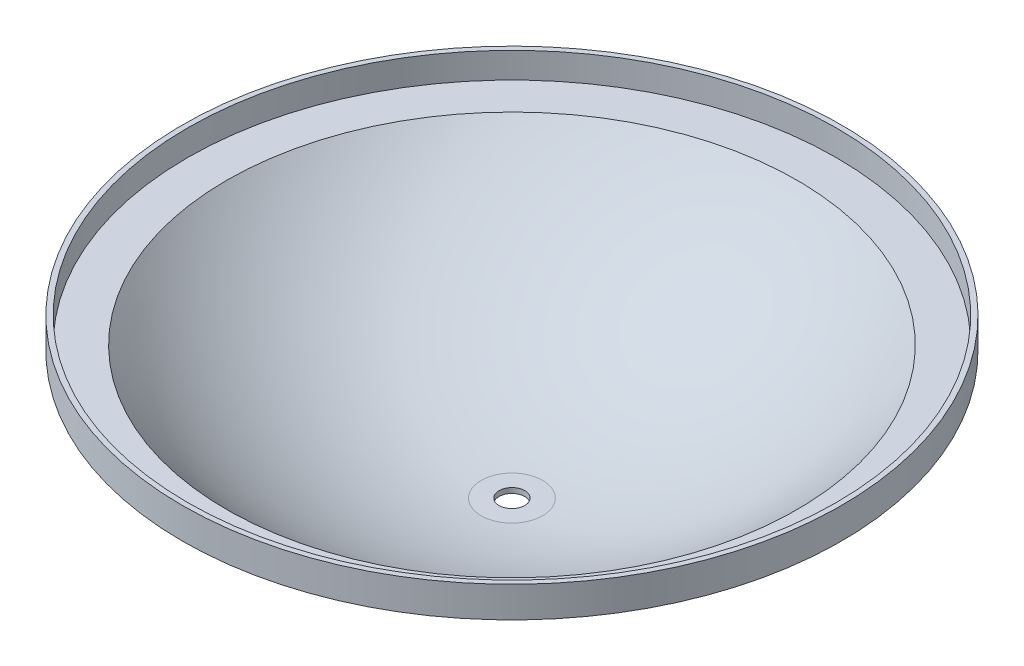
ISO-10303-21;
HEADER;
FILE_DESCRIPTION(('STEP AP214'),'2;1');
FILE_NAME('part.step','',(''),(''),'','','');
FILE_SCHEMA(('AUTOMOTIVE_DESIGN { 1 0 10303 214 1 1 1 1 }'));
ENDSEC;
DATA;
#1=APPLICATION_CONTEXT('core data for automotive mechanical design processes');
#2=APPLICATION_PROTOCOL_DEFINITION('international standard','automotive_design',2000,#1);
#3=PRODUCT_CONTEXT('',#1,'mechanical');
#4=PRODUCT('Part','Part','',(#3));
#5=PRODUCT_RELATED_PRODUCT_CATEGORY('part','',(#4));
#6=PRODUCT_DEFINITION_FORMATION('','',#4);
#7=PRODUCT_DEFINITION_CONTEXT('part definition',#1,'design');
#8=PRODUCT_DEFINITION('design','',#6,#7);
#9=PRODUCT_DEFINITION_SHAPE('','',#8);
#10=(LENGTH_UNIT() NAMED_UNIT(*) SI_UNIT(.MILLI.,.METRE.));
#11=(NAMED_UNIT(*) PLANE_ANGLE_UNIT() SI_UNIT($,.RADIAN.));
#12=(NAMED_UNIT(*) SI_UNIT($,.STERADIAN.) SOLID_ANGLE_UNIT());
#13=UNCERTAINTY_MEASURE_WITH_UNIT(LENGTH_MEASURE(1.E-05),#10,'distance_accuracy_value','');
#14=(GEOMETRIC_REPRESENTATION_CONTEXT(3) GLOBAL_UNCERTAINTY_ASSIGNED_CONTEXT((#13)) GLOBAL_UNIT_ASSIGNED_CONTEXT((#10,
#11,#12)) REPRESENTATION_CONTEXT('',''));
#15=CARTESIAN_POINT('',(0.,0.,0.));
#16=DIRECTION('',(0.,0.,1.));
#17=DIRECTION('',(1.,0.,0.));
#18=AXIS2_PLACEMENT_3D('',#15,#16,#17);
#19=CARTESIAN_POINT('',(-64.,-41.,0.));
#20=DIRECTION('',(0.,1.,0.));
#21=DIRECTION('',(0.,0.,1.));
#22=AXIS2_PLACEMENT_3D('',#19,#20,#21);
#23=PLANE('',#22);
#24=CARTESIAN_POINT('',(0.,-41.,0.));
#25=DIRECTION('',(0.,1.,0.));
#26=DIRECTION('',(0.,0.,1.));
#27=AXIS2_PLACEMENT_3D('',#24,#25,#26);
#28=CIRCLE('',#27,64.);
#29=CARTESIAN_POINT('',(0.,-41.,64.));
#30=VERTEX_POINT('',#29);
#31=EDGE_CURVE('E10',#30,#30,#28,.T.);
#32=ORIENTED_EDGE('',*,*,#31,.T.);
#33=EDGE_LOOP('',(#32));
#34=FACE_BOUND('',#33,.T.);
#35=CARTESIAN_POINT('',(0.,-41.,0.));
#36=DIRECTION('',(0.,1.,0.));
#37=DIRECTION('',(0.,0.,1.));
#38=AXIS2_PLACEMENT_3D('',#35,#36,#37);
#39=CIRCLE('',#38,63.);
#40=CARTESIAN_POINT('',(0.,-41.,63.));
#41=VERTEX_POINT('',#40);
#42=EDGE_CURVE('E69',#41,#41,#39,.T.);
#43=ORIENTED_EDGE('',*,*,#42,.F.);
#44=EDGE_LOOP('',(#43));
#45=FACE_BOUND('',#44,.T.);
#46=ADVANCED_FACE('F35',(#34,#45),#23,.T.);
#47=CARTESIAN_POINT('',(0.,36.2989122017747,0.));
#48=DIRECTION('',(0.,1.,0.));
#49=DIRECTION('',(0.,0.,1.));
#50=AXIS2_PLACEMENT_3D('',#47,#48,#49);
#51=CYLINDRICAL_SURFACE('',#50,64.);
#52=CARTESIAN_POINT('',(0.,-47.,0.));
#53=DIRECTION('',(0.,1.,0.));
#54=DIRECTION('',(0.,0.,1.));
#55=AXIS2_PLACEMENT_3D('',#52,#53,#54);
#56=CIRCLE('',#55,64.);
#57=CARTESIAN_POINT('',(0.,-47.,64.));
#58=VERTEX_POINT('',#57);
#59=EDGE_CURVE('E41',#58,#58,#56,.T.);
#60=ORIENTED_EDGE('',*,*,#59,.T.);
#61=EDGE_LOOP('',(#60));
#62=FACE_BOUND('',#61,.T.);
#63=ORIENTED_EDGE('',*,*,#31,.F.);
#64=EDGE_LOOP('',(#63));
#65=FACE_BOUND('',#64,.T.);
#66=ADVANCED_FACE('F77',(#62,#65),#51,.T.);
#67=CARTESIAN_POINT('',(-64.,-47.,0.));
#68=DIRECTION('',(0.,-1.,0.));
#69=DIRECTION('',(0.,0.,-1.));
#70=AXIS2_PLACEMENT_3D('',#67,#68,#69);
#71=PLANE('',#70);
#72=CARTESIAN_POINT('',(0.,-47.,0.));
#73=DIRECTION('',(0.,1.,0.));
#74=DIRECTION('',(0.,0.,1.));
#75=AXIS2_PLACEMENT_3D('',#72,#73,#74);
#76=CIRCLE('',#75,55.8569601750758);
#77=CARTESIAN_POINT('',(-55.8569601750758,-47.,0.));
#78=VERTEX_POINT('',#77);
#79=EDGE_CURVE('E45',#78,#78,#76,.T.);
#80=ORIENTED_EDGE('',*,*,#79,.T.);
#81=EDGE_LOOP('',(#80));
#82=FACE_BOUND('',#81,.T.);
#83=ORIENTED_EDGE('',*,*,#59,.F.);
#84=EDGE_LOOP('',(#83));
#85=FACE_BOUND('',#84,.T.);
#86=ADVANCED_FACE('F81',(#82,#85),#71,.T.);
#87=CARTESIAN_POINT('',(0.,0.,0.));
#88=DIRECTION('',(0.,1.,0.));
#89=DIRECTION('',(-1.,0.,0.));
#90=AXIS2_PLACEMENT_3D('',#87,#88,#89);
#91=SPHERICAL_SURFACE('',#90,73.);
#92=CARTESIAN_POINT('',(0.,-72.7530068107154,0.));
#93=DIRECTION('',(0.,1.,0.));
#94=DIRECTION('',(0.,0.,1.));
#95=AXIS2_PLACEMENT_3D('',#92,#93,#94);
#96=CIRCLE('',#95,5.99999999999998);
#97=CARTESIAN_POINT('',(-5.99999999999983,-72.7530068107154,0.));
#98=VERTEX_POINT('',#97);
#99=EDGE_CURVE('E49',#98,#98,#96,.T.);
#100=CARTESIAN_POINT('',(-5.99999999999983,-72.7530068107154,0.));
#101=CARTESIAN_POINT('',(-6.59794740306016,-72.7036952189983,0.));
#102=CARTESIAN_POINT('',(-7.19528652890829,-72.647008800253,0.));
#103=CARTESIAN_POINT('',(-8.3883858505504,-72.5189278211517,0.));
#104=CARTESIAN_POINT('',(-8.98414604634437,-72.4475332607957,0.));
#105=CARTESIAN_POINT('',(-10.1737251322484,-72.2900775109191,0.));
#106=CARTESIAN_POINT('',(-10.7675440223585,-72.2040163213985,0.));
#107=CARTESIAN_POINT('',(-11.9528795586112,-72.0172801375548,0.));
#108=CARTESIAN_POINT('',(-12.5443962047539,-71.9166051432318,0.));
#109=CARTESIAN_POINT('',(-13.7247676454467,-71.7007024161682,0.));
#110=CARTESIAN_POINT('',(-14.313622439997,-71.5854746834277,0.));
#111=CARTESIAN_POINT('',(-15.4883122065308,-71.3405365647845,0.));
#112=CARTESIAN_POINT('',(-16.0741471785144,-71.2108261788817,0.));
#113=CARTESIAN_POINT('',(-17.2424411597944,-70.9370015973304,0.));
#114=CARTESIAN_POINT('',(-17.8249001690909,-70.792887401682,0.));
#115=CARTESIAN_POINT('',(-18.9860881385073,-70.4903428127276,0.));
#116=CARTESIAN_POINT('',(-19.5648170986272,-70.3319124194217,0.));
#117=CARTESIAN_POINT('',(-20.7181931504065,-70.0008317469924,0.));
#118=CARTESIAN_POINT('',(-21.2928402420659,-69.8281814678689,0.));
#119=CARTESIAN_POINT('',(-22.4377032191726,-69.4687659810423,0.));
#120=CARTESIAN_POINT('',(-23.0079191046199,-69.282000773339,0.));
#121=CARTESIAN_POINT('',(-24.1435730253315,-68.8944689670589,0.));
#122=CARTESIAN_POINT('',(-24.7090110605958,-68.6937023684821,0.));
#123=CARTESIAN_POINT('',(-25.8347655415137,-68.2782898299088,0.));
#124=CARTESIAN_POINT('',(-26.3950819871673,-68.0636438899124,0.));
#125=CARTESIAN_POINT('',(-27.5102526629362,-67.6206031554257,0.));
#126=CARTESIAN_POINT('',(-28.0651068930515,-67.3922083609354,0.));
#127=CARTESIAN_POINT('',(-29.1690158323905,-66.9218087625542,0.));
#128=CARTESIAN_POINT('',(-29.7180705416142,-66.6798039586633,0.));
#129=CARTESIAN_POINT('',(-30.8100466594445,-66.18233146033,0.));
#130=CARTESIAN_POINT('',(-31.352968068051,-65.9268637658876,0.));
#131=CARTESIAN_POINT('',(-32.4323475334594,-65.4026207896215,0.));
#132=CARTESIAN_POINT('',(-32.9688055902613,-65.1338455077979,0.));
#133=CARTESIAN_POINT('',(-34.0349322300547,-64.5831507498489,0.));
#134=CARTESIAN_POINT('',(-34.5646008130462,-64.3012312737236,0.));
#135=CARTESIAN_POINT('',(-35.6168265106502,-63.7244195108309,0.));
#136=CARTESIAN_POINT('',(-36.1393836252627,-63.4295272240635,0.));
#137=CARTESIAN_POINT('',(-37.1770687147229,-62.8269491099392,0.));
#138=CARTESIAN_POINT('',(-37.6921966895706,-62.5192632825823,0.));
#139=CARTESIAN_POINT('',(-38.7147103444164,-61.8912851347431,0.));
#140=CARTESIAN_POINT('',(-39.2220960244146,-61.5709928142608,0.));
#141=CARTESIAN_POINT('',(-40.2288166411488,-60.9179963913368,0.));
#142=CARTESIAN_POINT('',(-40.7281515778849,-60.585292288895,0.));
#143=CARTESIAN_POINT('',(-41.7184671538702,-59.9076745585546,0.));
#144=CARTESIAN_POINT('',(-42.2094477931194,-59.5627609306561,0.));
#145=CARTESIAN_POINT('',(-43.182756298613,-58.8609338282726,0.));
#146=CARTESIAN_POINT('',(-43.6650841648575,-58.5040203537876,0.));
#147=CARTESIAN_POINT('',(-44.6207939090404,-57.7784105320553,0.));
#148=CARTESIAN_POINT('',(-45.0941757869788,-57.409714184808,0.));
#149=CARTESIAN_POINT('',(-46.0317057774879,-56.6607627542264,0.));
#150=CARTESIAN_POINT('',(-46.4958538900587,-56.2805076708921,0.));
#151=CARTESIAN_POINT('',(-47.4146341868025,-55.5086699321554,0.));
#152=CARTESIAN_POINT('',(-47.8692663709757,-55.117087276753,0.));
#153=CARTESIAN_POINT('',(-48.7687384302965,-54.3228324419185,0.));
#154=CARTESIAN_POINT('',(-49.2135783054443,-53.9201602624864,0.));
#155=CARTESIAN_POINT('',(-50.0931953283023,-53.1039711773706,0.));
#156=CARTESIAN_POINT('',(-50.5279724760126,-52.6904542716869,0.));
#157=CARTESIAN_POINT('',(-51.3871997081645,-51.8528270938295,0.));
#158=CARTESIAN_POINT('',(-51.8116497926061,-51.4287168216557,0.));
#159=CARTESIAN_POINT('',(-52.6499649699749,-50.5701608250817,0.));
#160=CARTESIAN_POINT('',(-53.063830062902,-50.1357151006814,0.));
#161=CARTESIAN_POINT('',(-53.8807232801659,-49.2567519692716,0.));
#162=CARTESIAN_POINT('',(-54.2837514045026,-48.812234562262,0.));
#163=CARTESIAN_POINT('',(-55.0787271004088,-47.9133995543608,0.));
#164=CARTESIAN_POINT('',(-55.4706746719783,-47.4590819534691,0.));
#165=CARTESIAN_POINT('',(-55.8569601750758,-47.,0.));
#166=B_SPLINE_CURVE_WITH_KNOTS('',3,(#100,#101,#102,#103,#104,#105,#106,#107,#108,#109,#110,
#111,#112,#113,#114,#115,#116,#117,#118,#119,#120,#121,#122,#123,#124,#125,#126,#127,#128,#129,
#130,#131,#132,#133,#134,#135,#136,#137,#138,#139,#140,#141,#142,#143,#144,#145,#146,#147,#148,
#149,#150,#151,#152,#153,#154,#155,#156,#157,#158,#159,#160,#161,#162,#163,#164,#165),
.UNSPECIFIED.,.F.,.F.,(4,2,2,2,2,2,2,2,2,2,2,2,2,2,2,2,2,2,2,2,2,2,2,2,2,2,2,2,2,2,2,2,4),(0.,
1.79988611370583,3.59977222741166,5.39965834111747,7.1995444548233,8.99943056852913,
10.799316682235,12.5992027959408,14.3990889096466,16.1989750233524,17.9988611370583,
19.7987472507641,21.5986333644699,23.3985194781757,25.1984055918816,26.9982917055874,
28.7981778192932,30.598063932999,32.3979500467049,34.1978361604107,35.9977222741165,
37.7976083878224,39.5974945015282,41.397380615234,43.1972667289398,44.9971528426456,
46.7970389563515,48.5969250700573,50.3968111837631,52.1966972974689,53.9965834111748,
55.7964695248806,57.5963556385864),.UNSPECIFIED.);
#167=EDGE_CURVE('BSEAM85',#98,#78,#166,.T.);
#168=ORIENTED_EDGE('',*,*,#99,.T.);
#169=ORIENTED_EDGE('',*,*,#79,.F.);
#170=ORIENTED_EDGE('',*,*,#167,.T.);
#171=ORIENTED_EDGE('',*,*,#167,.F.);
#172=EDGE_LOOP('',(#168,#170,#169,#171));
#173=FACE_BOUND('',#172,.T.);
#174=ADVANCED_FACE('F85',(#173),#91,.T.);
#175=CARTESIAN_POINT('',(-2.49999999999998,-72.7530068107154,0.));
#176=DIRECTION('',(0.,-1.,0.));
#177=DIRECTION('',(0.,0.,-1.));
#178=AXIS2_PLACEMENT_3D('',#175,#176,#177);
#179=PLANE('',#178);
#180=CARTESIAN_POINT('',(0.,-72.7530068107154,0.));
#181=DIRECTION('',(0.,1.,0.));
#182=DIRECTION('',(0.,0.,1.));
#183=AXIS2_PLACEMENT_3D('',#180,#181,#182);
#184=CIRCLE('',#183,2.49999999999998);
#185=CARTESIAN_POINT('',(0.,-72.7530068107154,2.49999999999998));
#186=VERTEX_POINT('',#185);
#187=EDGE_CURVE('E54',#186,#186,#184,.T.);
#188=ORIENTED_EDGE('',*,*,#187,.T.);
#189=EDGE_LOOP('',(#188));
#190=FACE_BOUND('',#189,.T.);
#191=ORIENTED_EDGE('',*,*,#99,.F.);
#192=EDGE_LOOP('',(#191));
#193=FACE_BOUND('',#192,.T.);
#194=ADVANCED_FACE('F92',(#190,#193),#179,.T.);
#195=CARTESIAN_POINT('',(0.,36.2989122017747,0.));
#196=DIRECTION('',(0.,1.,0.));
#197=DIRECTION('',(0.,0.,1.));
#198=AXIS2_PLACEMENT_3D('',#195,#196,#197);
#199=CYLINDRICAL_SURFACE('',#198,2.49999999999998);
#200=CARTESIAN_POINT('',(0.,-71.7530068107154,0.));
#201=DIRECTION('',(0.,1.,0.));
#202=DIRECTION('',(0.,0.,1.));
#203=AXIS2_PLACEMENT_3D('',#200,#201,#202);
#204=CIRCLE('',#203,2.49999999999998);
#205=CARTESIAN_POINT('',(0.,-71.7530068107154,2.49999999999998));
#206=VERTEX_POINT('',#205);
#207=EDGE_CURVE('E57',#206,#206,#204,.T.);
#208=ORIENTED_EDGE('',*,*,#207,.T.);
#209=EDGE_LOOP('',(#208));
#210=FACE_BOUND('',#209,.T.);
#211=ORIENTED_EDGE('',*,*,#187,.F.);
#212=EDGE_LOOP('',(#211));
#213=FACE_BOUND('',#212,.T.);
#214=ADVANCED_FACE('F96',(#210,#213),#199,.F.);
#215=CARTESIAN_POINT('',(-2.49999999999998,-71.7530068107154,0.));
#216=DIRECTION('',(0.,1.,0.));
#217=DIRECTION('',(0.,0.,1.));
#218=AXIS2_PLACEMENT_3D('',#215,#216,#217);
#219=PLANE('',#218);
#220=CARTESIAN_POINT('',(0.,-71.7530068107154,0.));
#221=DIRECTION('',(0.,1.,0.));
#222=DIRECTION('',(0.,0.,1.));
#223=AXIS2_PLACEMENT_3D('',#220,#221,#222);
#224=CIRCLE('',#223,5.95869227443659);
#225=CARTESIAN_POINT('',(-5.95869227443651,-71.7530068107154,0.));
#226=VERTEX_POINT('',#225);
#227=EDGE_CURVE('E60',#226,#226,#224,.T.);
#228=ORIENTED_EDGE('',*,*,#227,.T.);
#229=EDGE_LOOP('',(#228));
#230=FACE_BOUND('',#229,.T.);
#231=ORIENTED_EDGE('',*,*,#207,.F.);
#232=EDGE_LOOP('',(#231));
#233=FACE_BOUND('',#232,.T.);
#234=ADVANCED_FACE('F100',(#230,#233),#219,.T.);
#235=CARTESIAN_POINT('',(0.,0.,0.));
#236=DIRECTION('',(0.,1.,0.));
#237=DIRECTION('',(-1.,0.,0.));
#238=AXIS2_PLACEMENT_3D('',#235,#236,#237);
#239=SPHERICAL_SURFACE('',#238,72.);
#240=CARTESIAN_POINT('',(0.,-46.,0.));
#241=DIRECTION('',(0.,1.,0.));
#242=DIRECTION('',(0.,0.,1.));
#243=AXIS2_PLACEMENT_3D('',#240,#241,#242);
#244=CIRCLE('',#243,55.3895296965049);
#245=CARTESIAN_POINT('',(-55.3895296965049,-46.,0.));
#246=VERTEX_POINT('',#245);
#247=EDGE_CURVE('E63',#246,#246,#244,.T.);
#248=CARTESIAN_POINT('',(-55.3895296965049,-46.,0.));
#249=CARTESIAN_POINT('',(-55.008646684964,-46.4586314994839,0.));
#250=CARTESIAN_POINT('',(-54.6220649866801,-46.9125302512128,0.));
#251=CARTESIAN_POINT('',(-53.8377481679489,-47.8105869402255,0.));
#252=CARTESIAN_POINT('',(-53.4400130475016,-48.2547448775094,0.));
#253=CARTESIAN_POINT('',(-52.633633335766,-49.1330446186974,0.));
#254=CARTESIAN_POINT('',(-52.2249887444777,-49.5671864226016,0.));
#255=CARTESIAN_POINT('',(-51.3970426175679,-50.425186368543,0.));
#256=CARTESIAN_POINT('',(-50.9777410819464,-50.8490445105801,0.));
#257=CARTESIAN_POINT('',(-50.1287396742068,-51.6862155178882,0.));
#258=CARTESIAN_POINT('',(-49.6990398020887,-52.0995283831592,0.));
#259=CARTESIAN_POINT('',(-48.8295068774357,-52.9153538441746,0.));
#260=CARTESIAN_POINT('',(-48.3896738249009,-53.317866439919,0.));
#261=CARTESIAN_POINT('',(-47.5001459122703,-54.1118430019891,0.));
#262=CARTESIAN_POINT('',(-47.0504510521745,-54.5033069683147,0.));
#263=CARTESIAN_POINT('',(-46.1414769915934,-55.2749447370445,0.));
#264=CARTESIAN_POINT('',(-45.6821977911081,-55.6551185394487,0.));
#265=CARTESIAN_POINT('',(-44.7543384279839,-56.4039414097265,0.));
#266=CARTESIAN_POINT('',(-44.285758265345,-56.7725904776001,0.));
#267=CARTESIAN_POINT('',(-43.3395860955963,-57.4981364196523,0.));
#268=CARTESIAN_POINT('',(-42.8619940884867,-57.855033293831,0.));
#269=CARTESIAN_POINT('',(-41.8980929076735,-58.556854640363,0.));
#270=CARTESIAN_POINT('',(-41.41178373397,-58.9017791127163,0.));
#271=CARTESIAN_POINT('',(-40.4307482764534,-59.579442834573,0.));
#272=CARTESIAN_POINT('',(-39.9360219926404,-59.9121820840763,0.));
#273=CARTESIAN_POINT('',(-38.9384575647971,-60.5652700575728,0.));
#274=CARTESIAN_POINT('',(-38.4356194207669,-60.885618781566,0.));
#275=CARTESIAN_POINT('',(-37.4221415274649,-61.5137280464335,0.));
#276=CARTESIAN_POINT('',(-36.911501778193,-61.821488587308,0.));
#277=CARTESIAN_POINT('',(-35.8827357430325,-62.4242315953341,0.));
#278=CARTESIAN_POINT('',(-35.3646094571437,-62.7192140624857,0.));
#279=CARTESIAN_POINT('',(-34.3211900366245,-63.2962189166313,0.));
#280=CARTESIAN_POINT('',(-33.7958969019939,-63.5782413036253,0.));
#281=CARTESIAN_POINT('',(-32.7384678938666,-64.129151987489,0.));
#282=CARTESIAN_POINT('',(-32.2063320203698,-64.3980402843588,0.));
#283=CARTESIAN_POINT('',(-31.1355458664077,-64.9225168818418,0.));
#284=CARTESIAN_POINT('',(-30.5968955859423,-65.1781051824549,0.));
#285=CARTESIAN_POINT('',(-29.5134129693794,-65.675824087491,0.));
#286=CARTESIAN_POINT('',(-28.968580633282,-65.9179546919141,0.));
#287=CARTESIAN_POINT('',(-27.8730700711669,-66.3886088081384,0.));
#288=CARTESIAN_POINT('',(-27.3223918451494,-66.6171323199396,0.));
#289=CARTESIAN_POINT('',(-26.215529275865,-67.0604312501675,0.));
#290=CARTESIAN_POINT('',(-25.6593449325981,-67.275206668594,0.));
#291=CARTESIAN_POINT('',(-24.5418132988025,-67.6908768940028,0.));
#292=CARTESIAN_POINT('',(-23.9804660082737,-67.891771700985,0.));
#293=CARTESIAN_POINT('',(-22.852954835518,-68.2795567498614,0.));
#294=CARTESIAN_POINT('',(-22.286790953291,-68.4664469917555,0.));
#295=CARTESIAN_POINT('',(-21.1499959245832,-68.8261075978002,0.));
#296=CARTESIAN_POINT('',(-20.5793647781023,-68.9988779619508,0.));
#297=CARTESIAN_POINT('',(-19.4339873046412,-69.330192211684,0.));
#298=CARTESIAN_POINT('',(-18.859240977661,-69.4887360972667,0.));
#299=CARTESIAN_POINT('',(-17.7059877661509,-69.7914995677863,0.));
#300=CARTESIAN_POINT('',(-17.127480881621,-69.9357191527233,0.));
#301=CARTESIAN_POINT('',(-15.9670634978903,-70.209745034715,0.));
#302=CARTESIAN_POINT('',(-15.3851529986896,-70.3395513317696,0.));
#303=CARTESIAN_POINT('',(-14.2182874299091,-70.5846705564154,0.));
#304=CARTESIAN_POINT('',(-13.6333323603292,-70.6999834840064,0.));
#305=CARTESIAN_POINT('',(-12.4607385685428,-70.9160447838383,0.));
#306=CARTESIAN_POINT('',(-11.8730998463362,-71.016793156079,0.));
#307=CARTESIAN_POINT('',(-10.695501341776,-71.2036633205191,0.));
#308=CARTESIAN_POINT('',(-10.1055415594224,-71.2897851127183,0.));
#309=CARTESIAN_POINT('',(-8.92366488864951,-71.4473484649063,0.));
#310=CARTESIAN_POINT('',(-8.33174800023028,-71.5187900248949,0.));
#311=CARTESIAN_POINT('',(-7.1463225421044,-71.6469507523123,0.));
#312=CARTESIAN_POINT('',(-6.55281397239776,-71.7036699197411,0.));
#313=CARTESIAN_POINT('',(-5.95869227443651,-71.7530068107154,0.));
#314=B_SPLINE_CURVE_WITH_KNOTS('',3,(#248,#249,#250,#251,#252,#253,#254,#255,#256,#257,#258,
#259,#260,#261,#262,#263,#264,#265,#266,#267,#268,#269,#270,#271,#272,#273,#274,#275,#276,#277,
#278,#279,#280,#281,#282,#283,#284,#285,#286,#287,#288,#289,#290,#291,#292,#293,#294,#295,#296,
#297,#298,#299,#300,#301,#302,#303,#304,#305,#306,#307,#308,#309,#310,#311,#312,#313),
.UNSPECIFIED.,.F.,.F.,(4,2,2,2,2,2,2,2,2,2,2,2,2,2,2,2,2,2,2,2,2,2,2,2,2,2,2,2,2,2,2,2,4),(0.,
1.78845396589834,3.57690793179668,5.36536189769501,7.15381586359335,8.94226982949168,
10.73072379539,12.5191777612884,14.3076317271867,16.096085693085,17.8845396589834,
19.6729936248817,21.46144759078,23.2499015566784,25.0383555225767,26.826809488475,
28.6152634543734,30.4037174202717,32.1921713861701,33.9806253520684,35.7690793179667,
37.5575332838651,39.3459872497634,41.1344412156617,42.9228951815601,44.7113491474584,
46.4998031133567,48.2882570792551,50.0767110451534,51.8651650110517,53.6536189769501,
55.4420729428484,57.2305269087467),.UNSPECIFIED.);
#315=EDGE_CURVE('BSEAM104',#246,#226,#314,.T.);
#316=ORIENTED_EDGE('',*,*,#247,.T.);
#317=ORIENTED_EDGE('',*,*,#227,.F.);
#318=ORIENTED_EDGE('',*,*,#315,.T.);
#319=ORIENTED_EDGE('',*,*,#315,.F.);
#320=EDGE_LOOP('',(#316,#318,#317,#319));
#321=FACE_BOUND('',#320,.T.);
#322=ADVANCED_FACE('F104',(#321),#239,.F.);
#323=CARTESIAN_POINT('',(-63.,-46.,0.));
#324=DIRECTION('',(0.,1.,0.));
#325=DIRECTION('',(0.,0.,1.));
#326=AXIS2_PLACEMENT_3D('',#323,#324,#325);
#327=PLANE('',#326);
#328=CARTESIAN_POINT('',(0.,-46.,0.));
#329=DIRECTION('',(0.,1.,0.));
#330=DIRECTION('',(0.,0.,1.));
#331=AXIS2_PLACEMENT_3D('',#328,#329,#330);
#332=CIRCLE('',#331,63.);
#333=CARTESIAN_POINT('',(0.,-46.,63.));
#334=VERTEX_POINT('',#333);
#335=EDGE_CURVE('E66',#334,#334,#332,.T.);
#336=ORIENTED_EDGE('',*,*,#335,.T.);
#337=EDGE_LOOP('',(#336));
#338=FACE_BOUND('',#337,.T.);
#339=ORIENTED_EDGE('',*,*,#247,.F.);
#340=EDGE_LOOP('',(#339));
#341=FACE_BOUND('',#340,.T.);
#342=ADVANCED_FACE('F108',(#338,#341),#327,.T.);
#343=CARTESIAN_POINT('',(0.,36.2989122017747,0.));
#344=DIRECTION('',(0.,1.,0.));
#345=DIRECTION('',(0.,0.,1.));
#346=AXIS2_PLACEMENT_3D('',#343,#344,#345);
#347=CYLINDRICAL_SURFACE('',#346,63.);
#348=ORIENTED_EDGE('',*,*,#42,.T.);
#349=EDGE_LOOP('',(#348));
#350=FACE_BOUND('',#349,.T.);
#351=ORIENTED_EDGE('',*,*,#335,.F.);
#352=EDGE_LOOP('',(#351));
#353=FACE_BOUND('',#352,.T.);
#354=ADVANCED_FACE('F73',(#350,#353),#347,.F.);
#355=CLOSED_SHELL('',(#46,#66,#86,#174,#194,#214,#234,#322,#342,#354));
#356=MANIFOLD_SOLID_BREP('B2',#355);
#357=ADVANCED_BREP_SHAPE_REPRESENTATION('',(#18,#356),#14);
#358=SHAPE_DEFINITION_REPRESENTATION(#9,#357);
ENDSEC;
END-ISO-10303-21;
